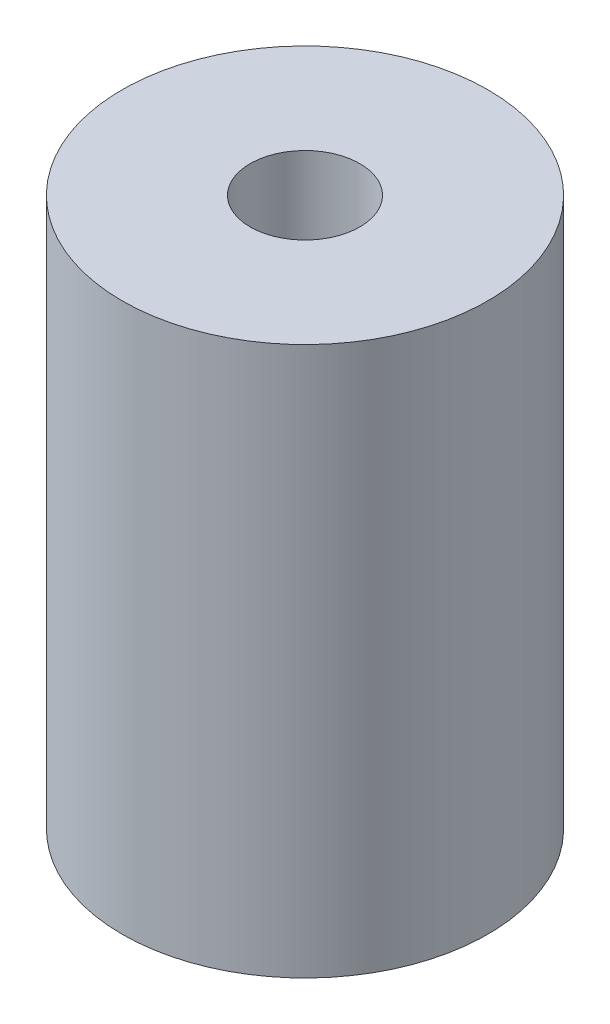
ISO-10303-21;
HEADER;
FILE_DESCRIPTION(('STEP AP214'),'2;1');
FILE_NAME('part.step','',(''),(''),'','','');
FILE_SCHEMA(('AUTOMOTIVE_DESIGN { 1 0 10303 214 1 1 1 1 }'));
ENDSEC;
DATA;
#1=APPLICATION_CONTEXT('core data for automotive mechanical design processes');
#2=APPLICATION_PROTOCOL_DEFINITION('international standard','automotive_design',2000,#1);
#3=PRODUCT_CONTEXT('',#1,'mechanical');
#4=PRODUCT('Part','Part','',(#3));
#5=PRODUCT_RELATED_PRODUCT_CATEGORY('part','',(#4));
#6=PRODUCT_DEFINITION_FORMATION('','',#4);
#7=PRODUCT_DEFINITION_CONTEXT('part definition',#1,'design');
#8=PRODUCT_DEFINITION('design','',#6,#7);
#9=PRODUCT_DEFINITION_SHAPE('','',#8);
#10=(LENGTH_UNIT() NAMED_UNIT(*) SI_UNIT(.MILLI.,.METRE.));
#11=(NAMED_UNIT(*) PLANE_ANGLE_UNIT() SI_UNIT($,.RADIAN.));
#12=(NAMED_UNIT(*) SI_UNIT($,.STERADIAN.) SOLID_ANGLE_UNIT());
#13=UNCERTAINTY_MEASURE_WITH_UNIT(LENGTH_MEASURE(1.E-05),#10,'distance_accuracy_value','');
#14=(GEOMETRIC_REPRESENTATION_CONTEXT(3) GLOBAL_UNCERTAINTY_ASSIGNED_CONTEXT((#13)) GLOBAL_UNIT_ASSIGNED_CONTEXT((#10,
#11,#12)) REPRESENTATION_CONTEXT('',''));
#15=CARTESIAN_POINT('',(0.,0.,0.));
#16=DIRECTION('',(0.,0.,1.));
#17=DIRECTION('',(1.,0.,0.));
#18=AXIS2_PLACEMENT_3D('',#15,#16,#17);
#19=CARTESIAN_POINT('',(0.,30.,0.));
#20=DIRECTION('',(0.,1.,0.));
#21=DIRECTION('',(0.,0.,1.));
#22=AXIS2_PLACEMENT_3D('',#19,#20,#21);
#23=PLANE('',#22);
#24=CARTESIAN_POINT('',(0.,30.,0.));
#25=DIRECTION('',(0.,1.,0.));
#26=DIRECTION('',(0.,0.,1.));
#27=AXIS2_PLACEMENT_3D('',#24,#25,#26);
#28=CIRCLE('',#27,10.);
#29=CARTESIAN_POINT('',(0.,30.,10.));
#30=VERTEX_POINT('',#29);
#31=EDGE_CURVE('E10',#30,#30,#28,.T.);
#32=ORIENTED_EDGE('',*,*,#31,.T.);
#33=EDGE_LOOP('',(#32));
#34=FACE_BOUND('',#33,.T.);
#35=CARTESIAN_POINT('',(0.,30.,0.));
#36=DIRECTION('',(0.,1.,0.));
#37=DIRECTION('',(0.,0.,1.));
#38=AXIS2_PLACEMENT_3D('',#35,#36,#37);
#39=CIRCLE('',#38,3.);
#40=CARTESIAN_POINT('',(0.,30.,3.));
#41=VERTEX_POINT('',#40);
#42=EDGE_CURVE('E44',#41,#41,#39,.T.);
#43=ORIENTED_EDGE('',*,*,#42,.F.);
#44=EDGE_LOOP('',(#43));
#45=FACE_BOUND('',#44,.T.);
#46=ADVANCED_FACE('F33',(#34,#45),#23,.T.);
#47=CARTESIAN_POINT('',(0.,0.,0.));
#48=DIRECTION('',(0.,1.,0.));
#49=DIRECTION('',(0.,0.,1.));
#50=AXIS2_PLACEMENT_3D('',#47,#48,#49);
#51=PLANE('',#50);
#52=CARTESIAN_POINT('',(0.,0.,0.));
#53=DIRECTION('',(0.,1.,0.));
#54=DIRECTION('',(0.,0.,1.));
#55=AXIS2_PLACEMENT_3D('',#52,#53,#54);
#56=CIRCLE('',#55,10.);
#57=CARTESIAN_POINT('',(0.,0.,10.));
#58=VERTEX_POINT('',#57);
#59=EDGE_CURVE('E37',#58,#58,#56,.T.);
#60=ORIENTED_EDGE('',*,*,#59,.F.);
#61=EDGE_LOOP('',(#60));
#62=FACE_BOUND('',#61,.T.);
#63=CARTESIAN_POINT('',(0.,0.,0.));
#64=DIRECTION('',(0.,1.,0.));
#65=DIRECTION('',(0.,0.,1.));
#66=AXIS2_PLACEMENT_3D('',#63,#64,#65);
#67=CIRCLE('',#66,3.);
#68=CARTESIAN_POINT('',(0.,0.,3.));
#69=VERTEX_POINT('',#68);
#70=EDGE_CURVE('E46',#69,#69,#67,.T.);
#71=ORIENTED_EDGE('',*,*,#70,.T.);
#72=EDGE_LOOP('',(#71));
#73=FACE_BOUND('',#72,.T.);
#74=ADVANCED_FACE('F56',(#62,#73),#51,.F.);
#75=CARTESIAN_POINT('',(0.,30.,0.));
#76=DIRECTION('',(0.,-1.,0.));
#77=DIRECTION('',(0.,0.,-1.));
#78=AXIS2_PLACEMENT_3D('',#75,#76,#77);
#79=CYLINDRICAL_SURFACE('',#78,10.);
#80=ORIENTED_EDGE('',*,*,#31,.F.);
#81=EDGE_LOOP('',(#80));
#82=FACE_BOUND('',#81,.T.);
#83=ORIENTED_EDGE('',*,*,#59,.T.);
#84=EDGE_LOOP('',(#83));
#85=FACE_BOUND('',#84,.T.);
#86=ADVANCED_FACE('F35',(#82,#85),#79,.T.);
#87=CARTESIAN_POINT('',(0.,30.,0.));
#88=DIRECTION('',(0.,-1.,0.));
#89=DIRECTION('',(0.,0.,-1.));
#90=AXIS2_PLACEMENT_3D('',#87,#88,#89);
#91=CYLINDRICAL_SURFACE('',#90,3.);
#92=ORIENTED_EDGE('',*,*,#42,.T.);
#93=EDGE_LOOP('',(#92));
#94=FACE_BOUND('',#93,.T.);
#95=ORIENTED_EDGE('',*,*,#70,.F.);
#96=EDGE_LOOP('',(#95));
#97=FACE_BOUND('',#96,.T.);
#98=ADVANCED_FACE('F52',(#94,#97),#91,.F.);
#99=CLOSED_SHELL('',(#46,#74,#86,#98));
#100=MANIFOLD_SOLID_BREP('B2',#99);
#101=ADVANCED_BREP_SHAPE_REPRESENTATION('',(#18,#100),#14);
#102=SHAPE_DEFINITION_REPRESENTATION(#9,#101);
ENDSEC;
END-ISO-10303-21;
